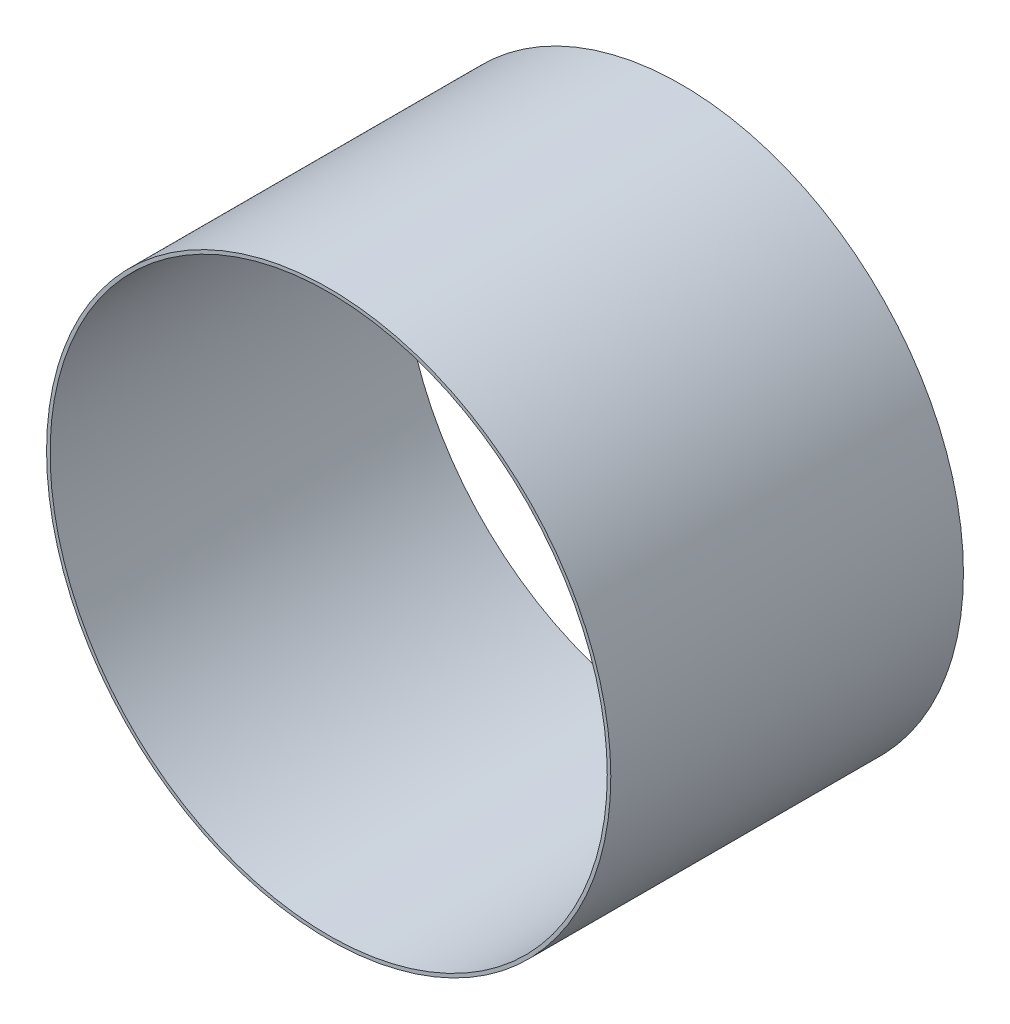
ISO-10303-21;
HEADER;
FILE_DESCRIPTION(('STEP AP214'),'2;1');
FILE_NAME('part.step','',(''),(''),'','','');
FILE_SCHEMA(('AUTOMOTIVE_DESIGN { 1 0 10303 214 1 1 1 1 }'));
ENDSEC;
DATA;
#1=APPLICATION_CONTEXT('core data for automotive mechanical design processes');
#2=APPLICATION_PROTOCOL_DEFINITION('international standard','automotive_design',2000,#1);
#3=PRODUCT_CONTEXT('',#1,'mechanical');
#4=PRODUCT('Part','Part','',(#3));
#5=PRODUCT_RELATED_PRODUCT_CATEGORY('part','',(#4));
#6=PRODUCT_DEFINITION_FORMATION('','',#4);
#7=PRODUCT_DEFINITION_CONTEXT('part definition',#1,'design');
#8=PRODUCT_DEFINITION('design','',#6,#7);
#9=PRODUCT_DEFINITION_SHAPE('','',#8);
#10=(LENGTH_UNIT() NAMED_UNIT(*) SI_UNIT(.MILLI.,.METRE.));
#11=(NAMED_UNIT(*) PLANE_ANGLE_UNIT() SI_UNIT($,.RADIAN.));
#12=(NAMED_UNIT(*) SI_UNIT($,.STERADIAN.) SOLID_ANGLE_UNIT());
#13=UNCERTAINTY_MEASURE_WITH_UNIT(LENGTH_MEASURE(1.E-05),#10,'distance_accuracy_value','');
#14=(GEOMETRIC_REPRESENTATION_CONTEXT(3) GLOBAL_UNCERTAINTY_ASSIGNED_CONTEXT((#13)) GLOBAL_UNIT_ASSIGNED_CONTEXT((#10,
#11,#12)) REPRESENTATION_CONTEXT('',''));
#15=CARTESIAN_POINT('',(0.,0.,0.));
#16=DIRECTION('',(0.,0.,1.));
#17=DIRECTION('',(1.,0.,0.));
#18=AXIS2_PLACEMENT_3D('',#15,#16,#17);
#19=CARTESIAN_POINT('',(-81.704431432631,22.3952214452214,30.));
#20=DIRECTION('',(0.,0.,1.));
#21=DIRECTION('',(1.,0.,0.));
#22=AXIS2_PLACEMENT_3D('',#19,#20,#21);
#23=PLANE('',#22);
#24=CARTESIAN_POINT('',(-81.704431432631,22.3952214452214,30.));
#25=DIRECTION('',(0.,0.,1.));
#26=DIRECTION('',(1.,0.,0.));
#27=AXIS2_PLACEMENT_3D('',#24,#25,#26);
#28=CIRCLE('',#27,24.);
#29=CARTESIAN_POINT('',(-57.704431432631,22.3952214452214,30.));
#30=VERTEX_POINT('',#29);
#31=EDGE_CURVE('E10',#30,#30,#28,.T.);
#32=ORIENTED_EDGE('',*,*,#31,.T.);
#33=EDGE_LOOP('',(#32));
#34=FACE_BOUND('',#33,.T.);
#35=CARTESIAN_POINT('',(-81.704431432631,22.3952214452214,30.));
#36=DIRECTION('',(0.,0.,1.));
#37=DIRECTION('',(1.,0.,0.));
#38=AXIS2_PLACEMENT_3D('',#35,#36,#37);
#39=CIRCLE('',#38,23.7);
#40=CARTESIAN_POINT('',(-58.004431432631,22.3952214452214,30.));
#41=VERTEX_POINT('',#40);
#42=EDGE_CURVE('E41',#41,#41,#39,.T.);
#43=ORIENTED_EDGE('',*,*,#42,.F.);
#44=EDGE_LOOP('',(#43));
#45=FACE_BOUND('',#44,.T.);
#46=ADVANCED_FACE('F30',(#34,#45),#23,.T.);
#47=CARTESIAN_POINT('',(-81.704431432631,22.3952214452214,0.));
#48=DIRECTION('',(0.,0.,1.));
#49=DIRECTION('',(1.,0.,0.));
#50=AXIS2_PLACEMENT_3D('',#47,#48,#49);
#51=PLANE('',#50);
#52=CARTESIAN_POINT('',(-81.704431432631,22.3952214452214,0.));
#53=DIRECTION('',(0.,0.,1.));
#54=DIRECTION('',(1.,0.,0.));
#55=AXIS2_PLACEMENT_3D('',#52,#53,#54);
#56=CIRCLE('',#55,24.);
#57=CARTESIAN_POINT('',(-57.704431432631,22.3952214452214,0.));
#58=VERTEX_POINT('',#57);
#59=EDGE_CURVE('E34',#58,#58,#56,.T.);
#60=ORIENTED_EDGE('',*,*,#59,.F.);
#61=EDGE_LOOP('',(#60));
#62=FACE_BOUND('',#61,.T.);
#63=CARTESIAN_POINT('',(-81.704431432631,22.3952214452214,0.));
#64=DIRECTION('',(0.,0.,1.));
#65=DIRECTION('',(1.,0.,0.));
#66=AXIS2_PLACEMENT_3D('',#63,#64,#65);
#67=CIRCLE('',#66,23.7);
#68=CARTESIAN_POINT('',(-58.004431432631,22.3952214452214,0.));
#69=VERTEX_POINT('',#68);
#70=EDGE_CURVE('E43',#69,#69,#67,.T.);
#71=ORIENTED_EDGE('',*,*,#70,.T.);
#72=EDGE_LOOP('',(#71));
#73=FACE_BOUND('',#72,.T.);
#74=ADVANCED_FACE('F53',(#62,#73),#51,.F.);
#75=CARTESIAN_POINT('',(-81.704431432631,22.3952214452214,30.));
#76=DIRECTION('',(0.,0.,-1.));
#77=DIRECTION('',(-1.,0.,0.));
#78=AXIS2_PLACEMENT_3D('',#75,#76,#77);
#79=CYLINDRICAL_SURFACE('',#78,24.);
#80=ORIENTED_EDGE('',*,*,#31,.F.);
#81=EDGE_LOOP('',(#80));
#82=FACE_BOUND('',#81,.T.);
#83=ORIENTED_EDGE('',*,*,#59,.T.);
#84=EDGE_LOOP('',(#83));
#85=FACE_BOUND('',#84,.T.);
#86=ADVANCED_FACE('F32',(#82,#85),#79,.T.);
#87=CARTESIAN_POINT('',(-81.704431432631,22.3952214452214,30.));
#88=DIRECTION('',(0.,0.,-1.));
#89=DIRECTION('',(-1.,0.,0.));
#90=AXIS2_PLACEMENT_3D('',#87,#88,#89);
#91=CYLINDRICAL_SURFACE('',#90,23.7);
#92=ORIENTED_EDGE('',*,*,#42,.T.);
#93=EDGE_LOOP('',(#92));
#94=FACE_BOUND('',#93,.T.);
#95=ORIENTED_EDGE('',*,*,#70,.F.);
#96=EDGE_LOOP('',(#95));
#97=FACE_BOUND('',#96,.T.);
#98=ADVANCED_FACE('F49',(#94,#97),#91,.F.);
#99=CLOSED_SHELL('',(#46,#74,#86,#98));
#100=MANIFOLD_SOLID_BREP('B2',#99);
#101=ADVANCED_BREP_SHAPE_REPRESENTATION('',(#18,#100),#14);
#102=SHAPE_DEFINITION_REPRESENTATION(#9,#101);
ENDSEC;
END-ISO-10303-21;
